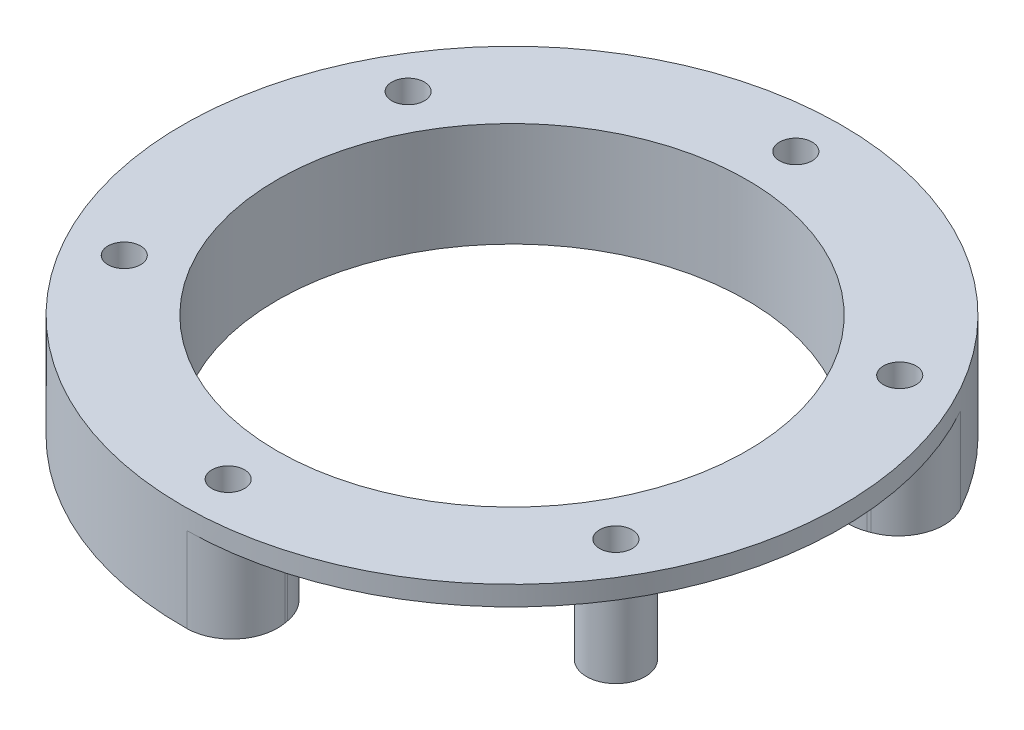
ISO-10303-21;
HEADER;
FILE_DESCRIPTION(('STEP AP214'),'2;1');
FILE_NAME('part.step','',(''),(''),'','','');
FILE_SCHEMA(('AUTOMOTIVE_DESIGN { 1 0 10303 214 1 1 1 1 }'));
ENDSEC;
DATA;
#1=APPLICATION_CONTEXT('core data for automotive mechanical design processes');
#2=APPLICATION_PROTOCOL_DEFINITION('international standard','automotive_design',2000,#1);
#3=PRODUCT_CONTEXT('',#1,'mechanical');
#4=PRODUCT('Part','Part','',(#3));
#5=PRODUCT_RELATED_PRODUCT_CATEGORY('part','',(#4));
#6=PRODUCT_DEFINITION_FORMATION('','',#4);
#7=PRODUCT_DEFINITION_CONTEXT('part definition',#1,'design');
#8=PRODUCT_DEFINITION('design','',#6,#7);
#9=PRODUCT_DEFINITION_SHAPE('','',#8);
#10=(LENGTH_UNIT() NAMED_UNIT(*) SI_UNIT(.MILLI.,.METRE.));
#11=(NAMED_UNIT(*) PLANE_ANGLE_UNIT() SI_UNIT($,.RADIAN.));
#12=(NAMED_UNIT(*) SI_UNIT($,.STERADIAN.) SOLID_ANGLE_UNIT());
#13=UNCERTAINTY_MEASURE_WITH_UNIT(LENGTH_MEASURE(1.E-05),#10,'distance_accuracy_value','');
#14=(GEOMETRIC_REPRESENTATION_CONTEXT(3) GLOBAL_UNCERTAINTY_ASSIGNED_CONTEXT((#13)) GLOBAL_UNIT_ASSIGNED_CONTEXT((#10,
#11,#12)) REPRESENTATION_CONTEXT('',''));
#15=CARTESIAN_POINT('',(0.,0.,0.));
#16=DIRECTION('',(0.,0.,1.));
#17=DIRECTION('',(1.,0.,0.));
#18=AXIS2_PLACEMENT_3D('',#15,#16,#17);
#19=CARTESIAN_POINT('',(0.,0.,0.));
#20=DIRECTION('',(0.,1.,0.));
#21=DIRECTION('',(0.,0.,1.));
#22=AXIS2_PLACEMENT_3D('',#19,#20,#21);
#23=PLANE('',#22);
#24=CARTESIAN_POINT('',(37.6721050646231,0.,21.75));
#25=DIRECTION('',(0.,1.,0.));
#26=DIRECTION('',(0.,0.,1.));
#27=AXIS2_PLACEMENT_3D('',#24,#25,#26);
#28=CIRCLE('',#27,2.49999999999999);
#29=CARTESIAN_POINT('',(37.6721050646231,0.,24.25));
#30=VERTEX_POINT('',#29);
#31=EDGE_CURVE('E258',#30,#30,#28,.T.);
#32=ORIENTED_EDGE('',*,*,#31,.T.);
#33=EDGE_LOOP('',(#32));
#34=FACE_BOUND('',#33,.T.);
#35=CARTESIAN_POINT('',(37.6721050646231,0.,21.75));
#36=DIRECTION('',(0.,-1.,0.));
#37=DIRECTION('',(0.,0.,-1.));
#38=AXIS2_PLACEMENT_3D('',#35,#36,#37);
#39=CIRCLE('',#38,4.5);
#40=CARTESIAN_POINT('',(37.6721050646231,0.,17.25));
#41=VERTEX_POINT('',#40);
#42=EDGE_CURVE('E229',#41,#41,#39,.T.);
#43=ORIENTED_EDGE('',*,*,#42,.T.);
#44=EDGE_LOOP('',(#43));
#45=FACE_BOUND('',#44,.T.);
#46=ADVANCED_FACE('F47',(#34,#45),#23,.F.);
#47=CARTESIAN_POINT('',(0.,16.,0.));
#48=DIRECTION('',(0.,1.,0.));
#49=DIRECTION('',(0.,0.,1.));
#50=AXIS2_PLACEMENT_3D('',#47,#48,#49);
#51=PLANE('',#50);
#52=CARTESIAN_POINT('',(0.,16.,-43.5));
#53=DIRECTION('',(0.,1.,0.));
#54=DIRECTION('',(0.,0.,1.));
#55=AXIS2_PLACEMENT_3D('',#52,#53,#54);
#56=CIRCLE('',#55,2.5);
#57=CARTESIAN_POINT('',(0.,16.,-41.));
#58=VERTEX_POINT('',#57);
#59=EDGE_CURVE('E207',#58,#58,#56,.T.);
#60=ORIENTED_EDGE('',*,*,#59,.F.);
#61=EDGE_LOOP('',(#60));
#62=FACE_BOUND('',#61,.T.);
#63=CARTESIAN_POINT('',(-37.6721050646231,16.,-21.75));
#64=DIRECTION('',(0.,1.,0.));
#65=DIRECTION('',(0.,0.,1.));
#66=AXIS2_PLACEMENT_3D('',#63,#64,#65);
#67=CIRCLE('',#66,2.5);
#68=CARTESIAN_POINT('',(-37.6721050646231,16.,-19.25));
#69=VERTEX_POINT('',#68);
#70=EDGE_CURVE('E227',#69,#69,#67,.T.);
#71=ORIENTED_EDGE('',*,*,#70,.F.);
#72=EDGE_LOOP('',(#71));
#73=FACE_BOUND('',#72,.T.);
#74=CARTESIAN_POINT('',(-37.6721050646231,16.,21.75));
#75=DIRECTION('',(0.,1.,0.));
#76=DIRECTION('',(0.,0.,1.));
#77=AXIS2_PLACEMENT_3D('',#74,#75,#76);
#78=CIRCLE('',#77,2.5);
#79=CARTESIAN_POINT('',(-37.6721050646231,16.,24.25));
#80=VERTEX_POINT('',#79);
#81=EDGE_CURVE('E247',#80,#80,#78,.T.);
#82=ORIENTED_EDGE('',*,*,#81,.F.);
#83=EDGE_LOOP('',(#82));
#84=FACE_BOUND('',#83,.T.);
#85=CARTESIAN_POINT('',(0.,16.,43.5));
#86=DIRECTION('',(0.,1.,0.));
#87=DIRECTION('',(0.,0.,1.));
#88=AXIS2_PLACEMENT_3D('',#85,#86,#87);
#89=CIRCLE('',#88,2.5);
#90=CARTESIAN_POINT('',(0.,16.,46.));
#91=VERTEX_POINT('',#90);
#92=EDGE_CURVE('E270',#91,#91,#89,.T.);
#93=ORIENTED_EDGE('',*,*,#92,.F.);
#94=EDGE_LOOP('',(#93));
#95=FACE_BOUND('',#94,.T.);
#96=CARTESIAN_POINT('',(37.6721050646231,16.,21.75));
#97=DIRECTION('',(0.,1.,0.));
#98=DIRECTION('',(0.,0.,1.));
#99=AXIS2_PLACEMENT_3D('',#96,#97,#98);
#100=CIRCLE('',#99,2.49999999999999);
#101=CARTESIAN_POINT('',(37.6721050646231,16.,24.25));
#102=VERTEX_POINT('',#101);
#103=EDGE_CURVE('E262',#102,#102,#100,.T.);
#104=ORIENTED_EDGE('',*,*,#103,.F.);
#105=EDGE_LOOP('',(#104));
#106=FACE_BOUND('',#105,.T.);
#107=CARTESIAN_POINT('',(37.6721050646231,16.,-21.75));
#108=DIRECTION('',(0.,1.,0.));
#109=DIRECTION('',(0.,0.,1.));
#110=AXIS2_PLACEMENT_3D('',#107,#108,#109);
#111=CIRCLE('',#110,2.5);
#112=CARTESIAN_POINT('',(37.6721050646231,16.,-19.25));
#113=VERTEX_POINT('',#112);
#114=EDGE_CURVE('E254',#113,#113,#111,.T.);
#115=ORIENTED_EDGE('',*,*,#114,.F.);
#116=EDGE_LOOP('',(#115));
#117=FACE_BOUND('',#116,.T.);
#118=CARTESIAN_POINT('',(0.,16.,0.));
#119=DIRECTION('',(0.,1.,0.));
#120=DIRECTION('',(0.,0.,1.));
#121=AXIS2_PLACEMENT_3D('',#118,#119,#120);
#122=CIRCLE('',#121,50.5);
#123=CARTESIAN_POINT('',(0.,16.,50.5));
#124=VERTEX_POINT('',#123);
#125=EDGE_CURVE('E147',#124,#124,#122,.T.);
#126=ORIENTED_EDGE('',*,*,#125,.T.);
#127=EDGE_LOOP('',(#126));
#128=FACE_BOUND('',#127,.T.);
#129=CARTESIAN_POINT('',(0.,16.,0.));
#130=DIRECTION('',(0.,1.,0.));
#131=DIRECTION('',(0.,0.,1.));
#132=AXIS2_PLACEMENT_3D('',#129,#130,#131);
#133=CIRCLE('',#132,36.);
#134=CARTESIAN_POINT('',(0.,16.,36.));
#135=VERTEX_POINT('',#134);
#136=EDGE_CURVE('E198',#135,#135,#133,.T.);
#137=ORIENTED_EDGE('',*,*,#136,.F.);
#138=EDGE_LOOP('',(#137));
#139=FACE_BOUND('',#138,.T.);
#140=ADVANCED_FACE('F283',(#62,#73,#84,#95,#106,#117,#128,#139),#51,.T.);
#141=CARTESIAN_POINT('',(0.,0.,-43.5));
#142=DIRECTION('',(0.,1.,0.));
#143=DIRECTION('',(0.,0.,1.));
#144=AXIS2_PLACEMENT_3D('',#141,#142,#143);
#145=CIRCLE('',#144,2.5);
#146=CARTESIAN_POINT('',(0.,0.,-41.));
#147=VERTEX_POINT('',#146);
#148=EDGE_CURVE('E199',#147,#147,#145,.T.);
#149=ORIENTED_EDGE('',*,*,#148,.T.);
#150=EDGE_LOOP('',(#149));
#151=FACE_BOUND('',#150,.T.);
#152=CARTESIAN_POINT('',(-37.6721050646231,0.,-21.75));
#153=DIRECTION('',(0.,1.,0.));
#154=DIRECTION('',(0.,0.,1.));
#155=AXIS2_PLACEMENT_3D('',#152,#153,#154);
#156=CIRCLE('',#155,2.5);
#157=CARTESIAN_POINT('',(-37.6721050646231,0.,-19.25));
#158=VERTEX_POINT('',#157);
#159=EDGE_CURVE('E243',#158,#158,#156,.T.);
#160=ORIENTED_EDGE('',*,*,#159,.T.);
#161=EDGE_LOOP('',(#160));
#162=FACE_BOUND('',#161,.T.);
#163=CARTESIAN_POINT('',(-37.6721050646231,0.,21.75));
#164=DIRECTION('',(0.,1.,0.));
#165=DIRECTION('',(0.,0.,1.));
#166=AXIS2_PLACEMENT_3D('',#163,#164,#165);
#167=CIRCLE('',#166,2.5);
#168=CARTESIAN_POINT('',(-37.6721050646231,0.,24.25));
#169=VERTEX_POINT('',#168);
#170=EDGE_CURVE('E274',#169,#169,#167,.T.);
#171=ORIENTED_EDGE('',*,*,#170,.T.);
#172=EDGE_LOOP('',(#171));
#173=FACE_BOUND('',#172,.T.);
#174=CARTESIAN_POINT('',(0.,0.,43.5));
#175=DIRECTION('',(0.,1.,0.));
#176=DIRECTION('',(0.,0.,1.));
#177=AXIS2_PLACEMENT_3D('',#174,#175,#176);
#178=CIRCLE('',#177,2.5);
#179=CARTESIAN_POINT('',(0.,0.,46.));
#180=VERTEX_POINT('',#179);
#181=EDGE_CURVE('E266',#180,#180,#178,.T.);
#182=ORIENTED_EDGE('',*,*,#181,.T.);
#183=EDGE_LOOP('',(#182));
#184=FACE_BOUND('',#183,.T.);
#185=CARTESIAN_POINT('',(37.6721050646231,0.,-21.75));
#186=DIRECTION('',(0.,1.,0.));
#187=DIRECTION('',(0.,0.,1.));
#188=AXIS2_PLACEMENT_3D('',#185,#186,#187);
#189=CIRCLE('',#188,2.5);
#190=CARTESIAN_POINT('',(37.6721050646231,0.,-19.25));
#191=VERTEX_POINT('',#190);
#192=EDGE_CURVE('E242',#191,#191,#189,.T.);
#193=ORIENTED_EDGE('',*,*,#192,.T.);
#194=EDGE_LOOP('',(#193));
#195=FACE_BOUND('',#194,.T.);
#196=CARTESIAN_POINT('',(0.,0.,0.));
#197=DIRECTION('',(0.,1.,0.));
#198=DIRECTION('',(0.,0.,1.));
#199=AXIS2_PLACEMENT_3D('',#196,#197,#198);
#200=CIRCLE('',#199,36.);
#201=CARTESIAN_POINT('',(31.3732803851504,0.,-17.6555169245972));
#202=VERTEX_POINT('',#201);
#203=CARTESIAN_POINT('',(0.396514018928035,0.,35.9978162758909));
#204=VERTEX_POINT('',#203);
#205=EDGE_CURVE('E192',#202,#204,#200,.T.);
#206=ORIENTED_EDGE('',*,*,#205,.T.);
#207=CARTESIAN_POINT('',(0.473613967052931,0.,42.9973916628697));
#208=DIRECTION('',(0.,1.,0.));
#209=DIRECTION('',(0.,0.,1.));
#210=AXIS2_PLACEMENT_3D('',#207,#208,#209);
#211=CIRCLE('',#210,7.);
#212=CARTESIAN_POINT('',(7.36726823813839,0.,41.7818544192011));
#213=VERTEX_POINT('',#212);
#214=EDGE_CURVE('E165',#204,#213,#211,.F.);
#215=ORIENTED_EDGE('',*,*,#214,.T.);
#216=DIRECTION('',(-0.173648177666931,0.,-0.984807753012208));
#217=VECTOR('',#216,1.);
#218=CARTESIAN_POINT('',(0.,0.,0.));
#219=LINE('',#218,#217);
#220=CARTESIAN_POINT('',(7.45525240137364,0.,42.2808374045715));
#221=VERTEX_POINT('',#220);
#222=EDGE_CURVE('E219',#221,#213,#219,.T.);
#223=ORIENTED_EDGE('',*,*,#222,.F.);
#224=CARTESIAN_POINT('',(0.561598130288186,0.,43.49637464824));
#225=DIRECTION('',(0.,1.,0.));
#226=DIRECTION('',(0.,0.,1.));
#227=AXIS2_PLACEMENT_3D('',#224,#225,#226);
#228=CIRCLE('',#227,7.);
#229=CARTESIAN_POINT('',(0.651970243208123,0.,50.4957912583016));
#230=VERTEX_POINT('',#229);
#231=EDGE_CURVE('E139',#221,#230,#228,.F.);
#232=ORIENTED_EDGE('',*,*,#231,.T.);
#233=CARTESIAN_POINT('',(0.,0.,0.));
#234=DIRECTION('',(0.,1.,0.));
#235=DIRECTION('',(0.,0.,1.));
#236=AXIS2_PLACEMENT_3D('',#233,#234,#235);
#237=CIRCLE('',#236,50.5);
#238=CARTESIAN_POINT('',(44.0566231354893,0.,-24.6832728360213));
#239=VERTEX_POINT('',#238);
#240=EDGE_CURVE('E204',#239,#230,#237,.T.);
#241=ORIENTED_EDGE('',*,*,#240,.F.);
#242=CARTESIAN_POINT('',(37.9497644830453,0.,-21.2618290765728));
#243=DIRECTION('',(0.,1.,0.));
#244=DIRECTION('',(0.,0.,1.));
#245=AXIS2_PLACEMENT_3D('',#242,#243,#244);
#246=CIRCLE('',#245,7.);
#247=CARTESIAN_POINT('',(40.343905486325,0.,-14.6839807310714));
#248=VERTEX_POINT('',#247);
#249=EDGE_CURVE('E157',#239,#248,#246,.F.);
#250=ORIENTED_EDGE('',*,*,#249,.T.);
#251=DIRECTION('',(0.939692620785907,0.,-0.342020143325673));
#252=VECTOR('',#251,1.);
#253=CARTESIAN_POINT('',(0.,0.,0.));
#254=LINE('',#253,#252);
#255=CARTESIAN_POINT('',(39.8677814633204,0.,-14.5106857588787));
#256=VERTEX_POINT('',#255);
#257=EDGE_CURVE('E222',#256,#248,#254,.T.);
#258=ORIENTED_EDGE('',*,*,#257,.F.);
#259=CARTESIAN_POINT('',(37.4736404600407,0.,-21.08853410438));
#260=DIRECTION('',(0.,1.,0.));
#261=DIRECTION('',(0.,0.,1.));
#262=AXIS2_PLACEMENT_3D('',#259,#260,#261);
#263=CIRCLE('',#262,7.);
#264=EDGE_CURVE('E160',#256,#202,#263,.F.);
#265=ORIENTED_EDGE('',*,*,#264,.T.);
#266=EDGE_LOOP('',(#206,#215,#223,#232,#241,#250,#258,#265));
#267=FACE_BOUND('',#266,.T.);
#268=ADVANCED_FACE('F195',(#151,#162,#173,#184,#195,#267),#23,.F.);
#269=CARTESIAN_POINT('',(0.,16.,0.));
#270=DIRECTION('',(0.,-1.,0.));
#271=DIRECTION('',(0.,0.,-1.));
#272=AXIS2_PLACEMENT_3D('',#269,#270,#271);
#273=CYLINDRICAL_SURFACE('',#272,50.5);
#274=ORIENTED_EDGE('',*,*,#125,.F.);
#275=EDGE_LOOP('',(#274));
#276=FACE_BOUND('',#275,.T.);
#277=ORIENTED_EDGE('',*,*,#240,.T.);
#278=DIRECTION('',(0.,-1.,0.));
#279=VECTOR('',#278,1.);
#280=CARTESIAN_POINT('',(0.651970243208124,16.,50.4957912583016));
#281=LINE('',#280,#279);
#282=CARTESIAN_POINT('',(0.651970243208123,13.,50.4957912583016));
#283=VERTEX_POINT('',#282);
#284=EDGE_CURVE('E172',#230,#283,#281,.F.);
#285=ORIENTED_EDGE('',*,*,#284,.T.);
#286=CARTESIAN_POINT('',(0.,13.,0.));
#287=DIRECTION('',(0.,1.,0.));
#288=DIRECTION('',(0.,0.,1.));
#289=AXIS2_PLACEMENT_3D('',#286,#287,#288);
#290=CIRCLE('',#289,50.5);
#291=CARTESIAN_POINT('',(44.0566231354893,13.,-24.6832728360213));
#292=VERTEX_POINT('',#291);
#293=EDGE_CURVE('E118',#292,#283,#290,.F.);
#294=ORIENTED_EDGE('',*,*,#293,.F.);
#295=DIRECTION('',(0.,-1.,0.));
#296=VECTOR('',#295,1.);
#297=CARTESIAN_POINT('',(44.0566231354893,16.,-24.6832728360213));
#298=LINE('',#297,#296);
#299=EDGE_CURVE('E168',#292,#239,#298,.T.);
#300=ORIENTED_EDGE('',*,*,#299,.T.);
#301=EDGE_LOOP('',(#277,#285,#294,#300));
#302=FACE_BOUND('',#301,.T.);
#303=ADVANCED_FACE('F217',(#276,#302),#273,.T.);
#304=CARTESIAN_POINT('',(0.,16.,0.));
#305=DIRECTION('',(0.,-1.,0.));
#306=DIRECTION('',(0.,0.,-1.));
#307=AXIS2_PLACEMENT_3D('',#304,#305,#306);
#308=CYLINDRICAL_SURFACE('',#307,36.);
#309=CARTESIAN_POINT('',(0.,13.,0.));
#310=DIRECTION('',(0.,1.,0.));
#311=DIRECTION('',(0.,0.,1.));
#312=AXIS2_PLACEMENT_3D('',#309,#310,#311);
#313=CIRCLE('',#312,36.);
#314=CARTESIAN_POINT('',(0.396514018928035,13.,35.9978162758909));
#315=VERTEX_POINT('',#314);
#316=CARTESIAN_POINT('',(31.3732803851504,13.,-17.6555169245972));
#317=VERTEX_POINT('',#316);
#318=EDGE_CURVE('E141',#315,#317,#313,.T.);
#319=ORIENTED_EDGE('',*,*,#318,.F.);
#320=DIRECTION('',(0.,-1.,0.));
#321=VECTOR('',#320,1.);
#322=CARTESIAN_POINT('',(0.396514018928035,16.,35.9978162758909));
#323=LINE('',#322,#321);
#324=EDGE_CURVE('E154',#315,#204,#323,.T.);
#325=ORIENTED_EDGE('',*,*,#324,.T.);
#326=ORIENTED_EDGE('',*,*,#205,.F.);
#327=DIRECTION('',(0.,-1.,0.));
#328=VECTOR('',#327,1.);
#329=CARTESIAN_POINT('',(31.3732803851504,16.,-17.6555169245972));
#330=LINE('',#329,#328);
#331=EDGE_CURVE('E145',#202,#317,#330,.F.);
#332=ORIENTED_EDGE('',*,*,#331,.T.);
#333=EDGE_LOOP('',(#319,#325,#326,#332));
#334=FACE_BOUND('',#333,.T.);
#335=ORIENTED_EDGE('',*,*,#136,.T.);
#336=EDGE_LOOP('',(#335));
#337=FACE_BOUND('',#336,.T.);
#338=ADVANCED_FACE('F190',(#334,#337),#308,.F.);
#339=CARTESIAN_POINT('',(37.6721050646231,0.,-21.75));
#340=DIRECTION('',(0.,1.,0.));
#341=DIRECTION('',(0.,0.,1.));
#342=AXIS2_PLACEMENT_3D('',#339,#340,#341);
#343=CYLINDRICAL_SURFACE('',#342,2.5);
#344=ORIENTED_EDGE('',*,*,#192,.F.);
#345=EDGE_LOOP('',(#344));
#346=FACE_BOUND('',#345,.T.);
#347=ORIENTED_EDGE('',*,*,#114,.T.);
#348=EDGE_LOOP('',(#347));
#349=FACE_BOUND('',#348,.T.);
#350=ADVANCED_FACE('F298',(#346,#349),#343,.F.);
#351=CARTESIAN_POINT('',(37.6721050646231,0.,21.75));
#352=DIRECTION('',(0.,1.,0.));
#353=DIRECTION('',(0.,0.,1.));
#354=AXIS2_PLACEMENT_3D('',#351,#352,#353);
#355=CYLINDRICAL_SURFACE('',#354,2.49999999999999);
#356=ORIENTED_EDGE('',*,*,#31,.F.);
#357=EDGE_LOOP('',(#356));
#358=FACE_BOUND('',#357,.T.);
#359=ORIENTED_EDGE('',*,*,#103,.T.);
#360=EDGE_LOOP('',(#359));
#361=FACE_BOUND('',#360,.T.);
#362=ADVANCED_FACE('F305',(#358,#361),#355,.F.);
#363=CARTESIAN_POINT('',(0.,0.,43.5));
#364=DIRECTION('',(0.,1.,0.));
#365=DIRECTION('',(0.,0.,1.));
#366=AXIS2_PLACEMENT_3D('',#363,#364,#365);
#367=CYLINDRICAL_SURFACE('',#366,2.5);
#368=ORIENTED_EDGE('',*,*,#181,.F.);
#369=EDGE_LOOP('',(#368));
#370=FACE_BOUND('',#369,.T.);
#371=ORIENTED_EDGE('',*,*,#92,.T.);
#372=EDGE_LOOP('',(#371));
#373=FACE_BOUND('',#372,.T.);
#374=ADVANCED_FACE('F334',(#370,#373),#367,.F.);
#375=CARTESIAN_POINT('',(-37.6721050646231,0.,21.75));
#376=DIRECTION('',(0.,1.,0.));
#377=DIRECTION('',(0.,0.,1.));
#378=AXIS2_PLACEMENT_3D('',#375,#376,#377);
#379=CYLINDRICAL_SURFACE('',#378,2.5);
#380=ORIENTED_EDGE('',*,*,#170,.F.);
#381=EDGE_LOOP('',(#380));
#382=FACE_BOUND('',#381,.T.);
#383=ORIENTED_EDGE('',*,*,#81,.T.);
#384=EDGE_LOOP('',(#383));
#385=FACE_BOUND('',#384,.T.);
#386=ADVANCED_FACE('F281',(#382,#385),#379,.F.);
#387=CARTESIAN_POINT('',(-37.6721050646231,0.,-21.75));
#388=DIRECTION('',(0.,1.,0.));
#389=DIRECTION('',(0.,0.,1.));
#390=AXIS2_PLACEMENT_3D('',#387,#388,#389);
#391=CYLINDRICAL_SURFACE('',#390,2.5);
#392=ORIENTED_EDGE('',*,*,#159,.F.);
#393=EDGE_LOOP('',(#392));
#394=FACE_BOUND('',#393,.T.);
#395=ORIENTED_EDGE('',*,*,#70,.T.);
#396=EDGE_LOOP('',(#395));
#397=FACE_BOUND('',#396,.T.);
#398=ADVANCED_FACE('F342',(#394,#397),#391,.F.);
#399=CARTESIAN_POINT('',(0.,0.,-43.5));
#400=DIRECTION('',(0.,1.,0.));
#401=DIRECTION('',(0.,0.,1.));
#402=AXIS2_PLACEMENT_3D('',#399,#400,#401);
#403=CYLINDRICAL_SURFACE('',#402,2.5);
#404=ORIENTED_EDGE('',*,*,#148,.F.);
#405=EDGE_LOOP('',(#404));
#406=FACE_BOUND('',#405,.T.);
#407=ORIENTED_EDGE('',*,*,#59,.T.);
#408=EDGE_LOOP('',(#407));
#409=FACE_BOUND('',#408,.T.);
#410=ADVANCED_FACE('F349',(#406,#409),#403,.F.);
#411=CARTESIAN_POINT('',(0.,99.9040785518956,0.));
#412=DIRECTION('',(-0.342020143325673,0.,-0.939692620785907));
#413=DIRECTION('',(-0.939692620785907,0.,0.342020143325673));
#414=AXIS2_PLACEMENT_3D('',#411,#412,#413);
#415=PLANE('',#414);
#416=DIRECTION('',(0.939692620785907,0.,-0.342020143325673));
#417=VECTOR('',#416,1.);
#418=CARTESIAN_POINT('',(0.,13.,0.));
#419=LINE('',#418,#417);
#420=CARTESIAN_POINT('',(39.8677814633204,13.,-14.5106857588787));
#421=VERTEX_POINT('',#420);
#422=CARTESIAN_POINT('',(40.343905486325,13.,-14.6839807310714));
#423=VERTEX_POINT('',#422);
#424=EDGE_CURVE('E136',#421,#423,#419,.T.);
#425=ORIENTED_EDGE('',*,*,#424,.F.);
#426=DIRECTION('',(0.,1.,0.));
#427=VECTOR('',#426,1.);
#428=CARTESIAN_POINT('',(39.8677814633204,0.,-14.5106857588787));
#429=LINE('',#428,#427);
#430=EDGE_CURVE('E177',#421,#256,#429,.F.);
#431=ORIENTED_EDGE('',*,*,#430,.T.);
#432=ORIENTED_EDGE('',*,*,#257,.T.);
#433=DIRECTION('',(0.,-1.,0.));
#434=VECTOR('',#433,1.);
#435=CARTESIAN_POINT('',(40.343905486325,99.9040785518956,-14.6839807310714));
#436=LINE('',#435,#434);
#437=EDGE_CURVE('E63',#248,#423,#436,.F.);
#438=ORIENTED_EDGE('',*,*,#437,.T.);
#439=EDGE_LOOP('',(#425,#431,#432,#438));
#440=FACE_BOUND('',#439,.T.);
#441=ADVANCED_FACE('F352',(#440),#415,.F.);
#442=CARTESIAN_POINT('',(0.,99.9040785518956,0.));
#443=DIRECTION('',(-0.984807753012208,0.,0.173648177666931));
#444=DIRECTION('',(0.173648177666931,0.,0.984807753012208));
#445=AXIS2_PLACEMENT_3D('',#442,#443,#444);
#446=PLANE('',#445);
#447=ORIENTED_EDGE('',*,*,#222,.T.);
#448=DIRECTION('',(0.,1.,0.));
#449=VECTOR('',#448,1.);
#450=CARTESIAN_POINT('',(7.36726823813839,13.,41.7818544192011));
#451=LINE('',#450,#449);
#452=CARTESIAN_POINT('',(7.36726823813839,13.,41.7818544192011));
#453=VERTEX_POINT('',#452);
#454=EDGE_CURVE('E134',#213,#453,#451,.T.);
#455=ORIENTED_EDGE('',*,*,#454,.T.);
#456=DIRECTION('',(-0.173648177666931,0.,-0.984807753012208));
#457=VECTOR('',#456,1.);
#458=CARTESIAN_POINT('',(0.,13.,0.));
#459=LINE('',#458,#457);
#460=CARTESIAN_POINT('',(7.45525240137364,13.,42.2808374045715));
#461=VERTEX_POINT('',#460);
#462=EDGE_CURVE('E117',#461,#453,#459,.T.);
#463=ORIENTED_EDGE('',*,*,#462,.F.);
#464=DIRECTION('',(0.,-1.,0.));
#465=VECTOR('',#464,1.);
#466=CARTESIAN_POINT('',(7.45525240137364,99.9040785518956,42.2808374045715));
#467=LINE('',#466,#465);
#468=EDGE_CURVE('E131',#461,#221,#467,.T.);
#469=ORIENTED_EDGE('',*,*,#468,.T.);
#470=EDGE_LOOP('',(#447,#455,#463,#469));
#471=FACE_BOUND('',#470,.T.);
#472=ADVANCED_FACE('F130',(#471),#446,.F.);
#473=CARTESIAN_POINT('',(37.6721050646231,99.9040785518956,21.75));
#474=DIRECTION('',(0.,-1.,0.));
#475=DIRECTION('',(0.,0.,-1.));
#476=AXIS2_PLACEMENT_3D('',#473,#474,#475);
#477=CYLINDRICAL_SURFACE('',#476,4.5);
#478=ORIENTED_EDGE('',*,*,#42,.F.);
#479=EDGE_LOOP('',(#478));
#480=FACE_BOUND('',#479,.T.);
#481=CARTESIAN_POINT('',(37.6721050646231,13.,21.75));
#482=DIRECTION('',(0.,1.,0.));
#483=DIRECTION('',(0.,0.,1.));
#484=AXIS2_PLACEMENT_3D('',#481,#482,#483);
#485=CIRCLE('',#484,4.5);
#486=CARTESIAN_POINT('',(37.6721050646231,13.,26.25));
#487=VERTEX_POINT('',#486);
#488=EDGE_CURVE('E221',#487,#487,#485,.F.);
#489=ORIENTED_EDGE('',*,*,#488,.T.);
#490=EDGE_LOOP('',(#489));
#491=FACE_BOUND('',#490,.T.);
#492=ADVANCED_FACE('F356',(#480,#491),#477,.T.);
#493=CARTESIAN_POINT('',(0.,13.,0.));
#494=DIRECTION('',(0.,1.,0.));
#495=DIRECTION('',(0.,0.,1.));
#496=AXIS2_PLACEMENT_3D('',#493,#494,#495);
#497=PLANE('',#496);
#498=ORIENTED_EDGE('',*,*,#318,.T.);
#499=CARTESIAN_POINT('',(37.4736404600407,13.,-21.08853410438));
#500=DIRECTION('',(0.,1.,0.));
#501=DIRECTION('',(0.,0.,1.));
#502=AXIS2_PLACEMENT_3D('',#499,#500,#501);
#503=CIRCLE('',#502,7.);
#504=EDGE_CURVE('E56',#317,#421,#503,.T.);
#505=ORIENTED_EDGE('',*,*,#504,.T.);
#506=ORIENTED_EDGE('',*,*,#424,.T.);
#507=CARTESIAN_POINT('',(37.9497644830453,13.,-21.2618290765728));
#508=DIRECTION('',(0.,1.,0.));
#509=DIRECTION('',(0.,0.,1.));
#510=AXIS2_PLACEMENT_3D('',#507,#508,#509);
#511=CIRCLE('',#510,7.);
#512=EDGE_CURVE('E12',#423,#292,#511,.T.);
#513=ORIENTED_EDGE('',*,*,#512,.T.);
#514=ORIENTED_EDGE('',*,*,#293,.T.);
#515=CARTESIAN_POINT('',(0.561598130288186,13.,43.49637464824));
#516=DIRECTION('',(0.,1.,0.));
#517=DIRECTION('',(0.,0.,1.));
#518=AXIS2_PLACEMENT_3D('',#515,#516,#517);
#519=CIRCLE('',#518,7.);
#520=EDGE_CURVE('E112',#283,#461,#519,.T.);
#521=ORIENTED_EDGE('',*,*,#520,.T.);
#522=ORIENTED_EDGE('',*,*,#462,.T.);
#523=CARTESIAN_POINT('',(0.473613967052931,13.,42.9973916628697));
#524=DIRECTION('',(0.,1.,0.));
#525=DIRECTION('',(0.,0.,1.));
#526=AXIS2_PLACEMENT_3D('',#523,#524,#525);
#527=CIRCLE('',#526,7.);
#528=EDGE_CURVE('E124',#453,#315,#527,.T.);
#529=ORIENTED_EDGE('',*,*,#528,.T.);
#530=EDGE_LOOP('',(#498,#505,#506,#513,#514,#521,#522,#529));
#531=FACE_BOUND('',#530,.T.);
#532=ORIENTED_EDGE('',*,*,#488,.F.);
#533=EDGE_LOOP('',(#532));
#534=FACE_BOUND('',#533,.T.);
#535=ADVANCED_FACE('F114',(#531,#534),#497,.F.);
#536=CARTESIAN_POINT('',(0.473613967052931,16.,42.9973916628697));
#537=DIRECTION('',(0.,-1.,0.));
#538=DIRECTION('',(0.,0.,-1.));
#539=AXIS2_PLACEMENT_3D('',#536,#537,#538);
#540=CYLINDRICAL_SURFACE('',#539,7.);
#541=ORIENTED_EDGE('',*,*,#214,.F.);
#542=ORIENTED_EDGE('',*,*,#324,.F.);
#543=ORIENTED_EDGE('',*,*,#528,.F.);
#544=ORIENTED_EDGE('',*,*,#454,.F.);
#545=EDGE_LOOP('',(#541,#542,#543,#544));
#546=FACE_BOUND('',#545,.T.);
#547=ADVANCED_FACE('F186',(#546),#540,.T.);
#548=CARTESIAN_POINT('',(0.561598130288186,16.,43.49637464824));
#549=DIRECTION('',(0.,-1.,0.));
#550=DIRECTION('',(0.,0.,-1.));
#551=AXIS2_PLACEMENT_3D('',#548,#549,#550);
#552=CYLINDRICAL_SURFACE('',#551,7.);
#553=ORIENTED_EDGE('',*,*,#520,.F.);
#554=ORIENTED_EDGE('',*,*,#284,.F.);
#555=ORIENTED_EDGE('',*,*,#231,.F.);
#556=ORIENTED_EDGE('',*,*,#468,.F.);
#557=EDGE_LOOP('',(#553,#554,#555,#556));
#558=FACE_BOUND('',#557,.T.);
#559=ADVANCED_FACE('F138',(#558),#552,.T.);
#560=CARTESIAN_POINT('',(37.4736404600407,16.,-21.08853410438));
#561=DIRECTION('',(0.,-1.,0.));
#562=DIRECTION('',(0.,0.,-1.));
#563=AXIS2_PLACEMENT_3D('',#560,#561,#562);
#564=CYLINDRICAL_SURFACE('',#563,7.);
#565=ORIENTED_EDGE('',*,*,#504,.F.);
#566=ORIENTED_EDGE('',*,*,#331,.F.);
#567=ORIENTED_EDGE('',*,*,#264,.F.);
#568=ORIENTED_EDGE('',*,*,#430,.F.);
#569=EDGE_LOOP('',(#565,#566,#567,#568));
#570=FACE_BOUND('',#569,.T.);
#571=ADVANCED_FACE('F385',(#570),#564,.T.);
#572=CARTESIAN_POINT('',(37.9497644830453,16.,-21.2618290765728));
#573=DIRECTION('',(0.,-1.,0.));
#574=DIRECTION('',(0.,0.,-1.));
#575=AXIS2_PLACEMENT_3D('',#572,#573,#574);
#576=CYLINDRICAL_SURFACE('',#575,7.);
#577=ORIENTED_EDGE('',*,*,#512,.F.);
#578=ORIENTED_EDGE('',*,*,#437,.F.);
#579=ORIENTED_EDGE('',*,*,#249,.F.);
#580=ORIENTED_EDGE('',*,*,#299,.F.);
#581=EDGE_LOOP('',(#577,#578,#579,#580));
#582=FACE_BOUND('',#581,.T.);
#583=ADVANCED_FACE('F49',(#582),#576,.T.);
#584=CLOSED_SHELL('',(#46,#140,#268,#303,#338,#350,#362,#374,#386,#398,#410,#441,#472,#492,#535,
#547,#559,#571,#583));
#585=MANIFOLD_SOLID_BREP('B2',#584);
#586=ADVANCED_BREP_SHAPE_REPRESENTATION('',(#18,#585),#14);
#587=SHAPE_DEFINITION_REPRESENTATION(#9,#586);
ENDSEC;
END-ISO-10303-21;
